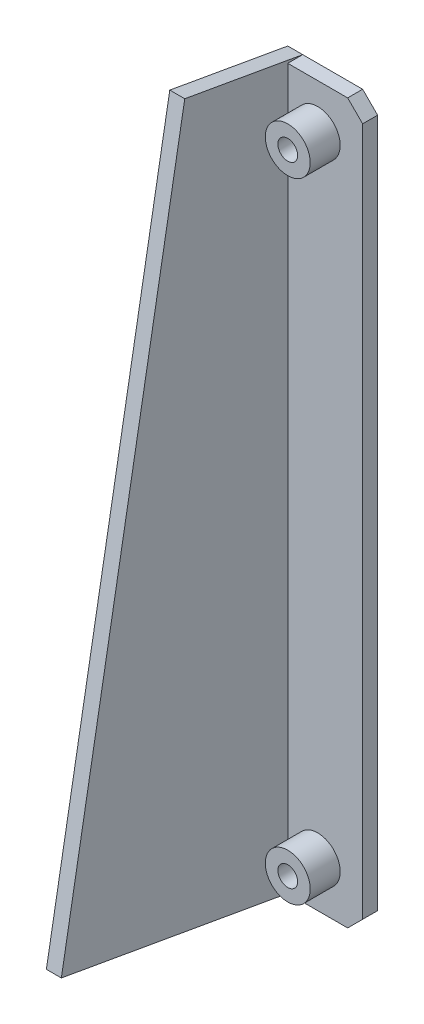
ISO-10303-21;
HEADER;
FILE_DESCRIPTION(('STEP AP214'),'2;1');
FILE_NAME('part.step','',(''),(''),'','','');
FILE_SCHEMA(('AUTOMOTIVE_DESIGN { 1 0 10303 214 1 1 1 1 }'));
ENDSEC;
DATA;
#1=APPLICATION_CONTEXT('core data for automotive mechanical design processes');
#2=APPLICATION_PROTOCOL_DEFINITION('international standard','automotive_design',2000,#1);
#3=PRODUCT_CONTEXT('',#1,'mechanical');
#4=PRODUCT('Part','Part','',(#3));
#5=PRODUCT_RELATED_PRODUCT_CATEGORY('part','',(#4));
#6=PRODUCT_DEFINITION_FORMATION('','',#4);
#7=PRODUCT_DEFINITION_CONTEXT('part definition',#1,'design');
#8=PRODUCT_DEFINITION('design','',#6,#7);
#9=PRODUCT_DEFINITION_SHAPE('','',#8);
#10=(LENGTH_UNIT() NAMED_UNIT(*) SI_UNIT(.MILLI.,.METRE.));
#11=(NAMED_UNIT(*) PLANE_ANGLE_UNIT() SI_UNIT($,.RADIAN.));
#12=(NAMED_UNIT(*) SI_UNIT($,.STERADIAN.) SOLID_ANGLE_UNIT());
#13=UNCERTAINTY_MEASURE_WITH_UNIT(LENGTH_MEASURE(1.E-05),#10,'distance_accuracy_value','');
#14=(GEOMETRIC_REPRESENTATION_CONTEXT(3) GLOBAL_UNCERTAINTY_ASSIGNED_CONTEXT((#13)) GLOBAL_UNIT_ASSIGNED_CONTEXT((#10,
#11,#12)) REPRESENTATION_CONTEXT('',''));
#15=CARTESIAN_POINT('',(0.,0.,0.));
#16=DIRECTION('',(0.,0.,1.));
#17=DIRECTION('',(1.,0.,0.));
#18=AXIS2_PLACEMENT_3D('',#15,#16,#17);
#19=CARTESIAN_POINT('',(0.,2.2977111480569,13.030967460708));
#20=DIRECTION('',(0.,0.173648177666931,0.984807753012208));
#21=DIRECTION('',(0.,-0.984807753012208,0.173648177666931));
#22=AXIS2_PLACEMENT_3D('',#19,#20,#21);
#23=PLANE('',#22);
#24=DIRECTION('',(-0.9995315720834,-0.030139564777048,0.00531441845700435));
#25=VECTOR('',#24,1.);
#26=CARTESIAN_POINT('',(-7.93749999999999,76.2,0.));
#27=LINE('',#26,#25);
#28=CARTESIAN_POINT('',(-7.93749999999999,76.2,0.));
#29=VERTEX_POINT('',#28);
#30=CARTESIAN_POINT('',(-9.525,76.1521310177488,0.00844059310994169));
#31=VERTEX_POINT('',#30);
#32=EDGE_CURVE('E145',#29,#31,#27,.T.);
#33=ORIENTED_EDGE('',*,*,#32,.F.);
#34=DIRECTION('',(-0.701673843159863,-0.701673843159863,0.123724030206484));
#35=VECTOR('',#34,1.);
#36=CARTESIAN_POINT('',(-9.63851621968364,74.4989837803164,0.299935054152948));
#37=LINE('',#36,#35);
#38=CARTESIAN_POINT('',(-9.525,74.6125,0.279919081874694));
#39=VERTEX_POINT('',#38);
#40=EDGE_CURVE('E11',#39,#29,#37,.F.);
#41=ORIENTED_EDGE('',*,*,#40,.F.);
#42=DIRECTION('',(0.,0.984807753012208,-0.173648177666931));
#43=VECTOR('',#42,1.);
#44=CARTESIAN_POINT('',(-9.525,76.2,0.));
#45=LINE('',#44,#43);
#46=EDGE_CURVE('E51',#39,#31,#45,.T.);
#47=ORIENTED_EDGE('',*,*,#46,.T.);
#48=EDGE_LOOP('',(#33,#41,#47));
#49=FACE_BOUND('',#48,.T.);
#50=ADVANCED_FACE('F35',(#49),#23,.F.);
#51=CARTESIAN_POINT('',(-9.525,74.6125,1.5875));
#52=DIRECTION('',(0.707106781186548,-0.707106781186548,0.));
#53=DIRECTION('',(0.,0.,-1.));
#54=AXIS2_PLACEMENT_3D('',#51,#52,#53);
#55=PLANE('',#54);
#56=DIRECTION('',(0.,0.,-1.));
#57=VECTOR('',#56,1.);
#58=CARTESIAN_POINT('',(-9.525,74.6125,1.5875));
#59=LINE('',#58,#57);
#60=CARTESIAN_POINT('',(-9.525,74.6125,0.));
#61=VERTEX_POINT('',#60);
#62=EDGE_CURVE('E58',#39,#61,#59,.T.);
#63=ORIENTED_EDGE('',*,*,#62,.F.);
#64=ORIENTED_EDGE('',*,*,#40,.T.);
#65=DIRECTION('',(-0.707106781186548,-0.707106781186548,0.));
#66=VECTOR('',#65,1.);
#67=CARTESIAN_POINT('',(-9.525,74.6125,0.));
#68=LINE('',#67,#66);
#69=EDGE_CURVE('E232',#61,#29,#68,.F.);
#70=ORIENTED_EDGE('',*,*,#69,.F.);
#71=EDGE_LOOP('',(#63,#64,#70));
#72=FACE_BOUND('',#71,.T.);
#73=ADVANCED_FACE('F297',(#72),#55,.F.);
#74=CARTESIAN_POINT('',(0.,0.,1.5875));
#75=DIRECTION('',(0.,0.,1.));
#76=DIRECTION('',(1.,0.,0.));
#77=AXIS2_PLACEMENT_3D('',#74,#75,#76);
#78=PLANE('',#77);
#79=DIRECTION('',(0.,1.,0.));
#80=VECTOR('',#79,1.);
#81=CARTESIAN_POINT('',(-7.93749999999996,62.1441984664619,1.58750000000001));
#82=LINE('',#81,#80);
#83=CARTESIAN_POINT('',(-7.93749999999984,0.,1.58750000000001));
#84=VERTEX_POINT('',#83);
#85=CARTESIAN_POINT('',(-7.93749999999999,76.2,1.5875));
#86=VERTEX_POINT('',#85);
#87=EDGE_CURVE('E149',#84,#86,#82,.T.);
#88=ORIENTED_EDGE('',*,*,#87,.F.);
#89=DIRECTION('',(1.,0.,0.));
#90=VECTOR('',#89,1.);
#91=CARTESIAN_POINT('',(0.,0.,1.5875));
#92=LINE('',#91,#90);
#93=CARTESIAN_POINT('',(-1.58750000000001,0.,1.5875));
#94=VERTEX_POINT('',#93);
#95=EDGE_CURVE('E209',#84,#94,#92,.T.);
#96=ORIENTED_EDGE('',*,*,#95,.T.);
#97=DIRECTION('',(-0.707106781186551,-0.707106781186544,0.));
#98=VECTOR('',#97,1.);
#99=CARTESIAN_POINT('',(-0.793749999999999,0.793750000000006,1.5875));
#100=LINE('',#99,#98);
#101=CARTESIAN_POINT('',(0.,1.5875,1.5875));
#102=VERTEX_POINT('',#101);
#103=EDGE_CURVE('E245',#94,#102,#100,.F.);
#104=ORIENTED_EDGE('',*,*,#103,.T.);
#105=DIRECTION('',(0.,1.,0.));
#106=VECTOR('',#105,1.);
#107=CARTESIAN_POINT('',(0.,0.,1.5875));
#108=LINE('',#107,#106);
#109=CARTESIAN_POINT('',(0.,74.6125,1.5875));
#110=VERTEX_POINT('',#109);
#111=EDGE_CURVE('E202',#102,#110,#108,.T.);
#112=ORIENTED_EDGE('',*,*,#111,.T.);
#113=DIRECTION('',(0.707106781186548,-0.707106781186548,0.));
#114=VECTOR('',#113,1.);
#115=CARTESIAN_POINT('',(37.30625,37.30625,1.5875));
#116=LINE('',#115,#114);
#117=CARTESIAN_POINT('',(-1.5875,76.2,1.5875));
#118=VERTEX_POINT('',#117);
#119=EDGE_CURVE('E247',#110,#118,#116,.F.);
#120=ORIENTED_EDGE('',*,*,#119,.T.);
#121=DIRECTION('',(-1.,0.,0.));
#122=VECTOR('',#121,1.);
#123=CARTESIAN_POINT('',(0.,76.2,1.5875));
#124=LINE('',#123,#122);
#125=EDGE_CURVE('E205',#118,#86,#124,.T.);
#126=ORIENTED_EDGE('',*,*,#125,.T.);
#127=EDGE_LOOP('',(#88,#96,#104,#112,#120,#126));
#128=FACE_BOUND('',#127,.T.);
#129=CARTESIAN_POINT('',(-4.7625,4.7625,1.5875));
#130=DIRECTION('',(0.,0.,1.));
#131=DIRECTION('',(1.,0.,0.));
#132=AXIS2_PLACEMENT_3D('',#129,#130,#131);
#133=CIRCLE('',#132,2.38125);
#134=CARTESIAN_POINT('',(-2.38125,4.7625,1.5875));
#135=VERTEX_POINT('',#134);
#136=EDGE_CURVE('E189',#135,#135,#133,.T.);
#137=ORIENTED_EDGE('',*,*,#136,.F.);
#138=EDGE_LOOP('',(#137));
#139=FACE_BOUND('',#138,.T.);
#140=CARTESIAN_POINT('',(-4.7625,71.4375,1.5875));
#141=DIRECTION('',(0.,0.,1.));
#142=DIRECTION('',(-1.,0.,0.));
#143=AXIS2_PLACEMENT_3D('',#140,#141,#142);
#144=CIRCLE('',#143,2.38125);
#145=CARTESIAN_POINT('',(-7.14375,71.4375,1.5875));
#146=VERTEX_POINT('',#145);
#147=EDGE_CURVE('E180',#146,#146,#144,.T.);
#148=ORIENTED_EDGE('',*,*,#147,.F.);
#149=EDGE_LOOP('',(#148));
#150=FACE_BOUND('',#149,.T.);
#151=ADVANCED_FACE('F263',(#128,#139,#150),#78,.T.);
#152=CARTESIAN_POINT('',(0.,0.,1.5875));
#153=DIRECTION('',(-1.,0.,0.));
#154=DIRECTION('',(0.,0.,1.));
#155=AXIS2_PLACEMENT_3D('',#152,#153,#154);
#156=PLANE('',#155);
#157=DIRECTION('',(0.,1.,0.));
#158=VECTOR('',#157,1.);
#159=CARTESIAN_POINT('',(0.,0.,0.));
#160=LINE('',#159,#158);
#161=CARTESIAN_POINT('',(0.,1.5875,0.));
#162=VERTEX_POINT('',#161);
#163=CARTESIAN_POINT('',(0.,74.6125,0.));
#164=VERTEX_POINT('',#163);
#165=EDGE_CURVE('E201',#162,#164,#160,.T.);
#166=ORIENTED_EDGE('',*,*,#165,.T.);
#167=DIRECTION('',(0.,0.,1.));
#168=VECTOR('',#167,1.);
#169=CARTESIAN_POINT('',(0.,74.6125,1.5875));
#170=LINE('',#169,#168);
#171=EDGE_CURVE('E240',#164,#110,#170,.T.);
#172=ORIENTED_EDGE('',*,*,#171,.T.);
#173=ORIENTED_EDGE('',*,*,#111,.F.);
#174=DIRECTION('',(0.,0.,-1.));
#175=VECTOR('',#174,1.);
#176=CARTESIAN_POINT('',(0.,1.5875,1.5875));
#177=LINE('',#176,#175);
#178=EDGE_CURVE('E237',#102,#162,#177,.T.);
#179=ORIENTED_EDGE('',*,*,#178,.T.);
#180=EDGE_LOOP('',(#166,#172,#173,#179));
#181=FACE_BOUND('',#180,.T.);
#182=ADVANCED_FACE('F270',(#181),#156,.F.);
#183=CARTESIAN_POINT('',(0.,76.2,1.5875));
#184=DIRECTION('',(0.,-1.,0.));
#185=DIRECTION('',(1.,0.,0.));
#186=AXIS2_PLACEMENT_3D('',#183,#184,#185);
#187=PLANE('',#186);
#188=ORIENTED_EDGE('',*,*,#125,.F.);
#189=DIRECTION('',(0.,0.,-1.));
#190=VECTOR('',#189,1.);
#191=CARTESIAN_POINT('',(-1.5875,76.2,1.5875));
#192=LINE('',#191,#190);
#193=CARTESIAN_POINT('',(-1.5875,76.2,0.));
#194=VERTEX_POINT('',#193);
#195=EDGE_CURVE('E225',#118,#194,#192,.T.);
#196=ORIENTED_EDGE('',*,*,#195,.T.);
#197=DIRECTION('',(-1.,0.,0.));
#198=VECTOR('',#197,1.);
#199=CARTESIAN_POINT('',(0.,76.2,0.));
#200=LINE('',#199,#198);
#201=EDGE_CURVE('E215',#194,#29,#200,.T.);
#202=ORIENTED_EDGE('',*,*,#201,.T.);
#203=DIRECTION('',(0.,0.,1.));
#204=VECTOR('',#203,1.);
#205=CARTESIAN_POINT('',(-7.93749999999999,76.2,1.5875));
#206=LINE('',#205,#204);
#207=EDGE_CURVE('E212',#29,#86,#206,.T.);
#208=ORIENTED_EDGE('',*,*,#207,.T.);
#209=EDGE_LOOP('',(#188,#196,#202,#208));
#210=FACE_BOUND('',#209,.T.);
#211=ADVANCED_FACE('F281',(#210),#187,.F.);
#212=CARTESIAN_POINT('',(-9.52500000000001,0.,1.5875));
#213=DIRECTION('',(1.,0.,0.));
#214=DIRECTION('',(0.,1.,0.));
#215=AXIS2_PLACEMENT_3D('',#212,#213,#214);
#216=PLANE('',#215);
#217=ORIENTED_EDGE('',*,*,#46,.F.);
#218=ORIENTED_EDGE('',*,*,#62,.T.);
#219=DIRECTION('',(0.,-1.,0.));
#220=VECTOR('',#219,1.);
#221=CARTESIAN_POINT('',(-9.52500000000001,0.,0.));
#222=LINE('',#221,#220);
#223=CARTESIAN_POINT('',(-9.52500000000001,1.58749999999999,0.));
#224=VERTEX_POINT('',#223);
#225=EDGE_CURVE('E218',#61,#224,#222,.T.);
#226=ORIENTED_EDGE('',*,*,#225,.T.);
#227=DIRECTION('',(0.,0.,1.));
#228=VECTOR('',#227,1.);
#229=CARTESIAN_POINT('',(-9.52500000000001,1.58749999999999,1.5875));
#230=LINE('',#229,#228);
#231=CARTESIAN_POINT('',(-9.52500000000001,1.58749999999999,1.5875));
#232=VERTEX_POINT('',#231);
#233=EDGE_CURVE('E249',#224,#232,#230,.T.);
#234=ORIENTED_EDGE('',*,*,#233,.T.);
#235=DIRECTION('',(0.,-1.,0.));
#236=VECTOR('',#235,1.);
#237=CARTESIAN_POINT('',(-9.52499999999997,62.1441984664619,1.58750000000001));
#238=LINE('',#237,#236);
#239=CARTESIAN_POINT('',(-9.52499999999984,0.,1.58750000000001));
#240=VERTEX_POINT('',#239);
#241=EDGE_CURVE('E151',#232,#240,#238,.T.);
#242=ORIENTED_EDGE('',*,*,#241,.T.);
#243=DIRECTION('',(0.,-0.173648177666931,-0.984807753012208));
#244=VECTOR('',#243,1.);
#245=CARTESIAN_POINT('',(-9.52499999999985,4.23156451566216,25.5858949062142));
#246=LINE('',#245,#244);
#247=CARTESIAN_POINT('',(-9.52499999999985,4.23156451566216,25.5858949062142));
#248=VERTEX_POINT('',#247);
#249=EDGE_CURVE('E168',#248,#240,#246,.T.);
#250=ORIENTED_EDGE('',*,*,#249,.F.);
#251=DIRECTION('',(0.,0.984807753012208,-0.173648177666931));
#252=VECTOR('',#251,1.);
#253=CARTESIAN_POINT('',(-9.52500000000001,78.40533185637,12.507058463255));
#254=LINE('',#253,#252);
#255=CARTESIAN_POINT('',(-9.52500000000001,78.40533185637,12.507058463255));
#256=VERTEX_POINT('',#255);
#257=EDGE_CURVE('E155',#248,#256,#254,.T.);
#258=ORIENTED_EDGE('',*,*,#257,.T.);
#259=DIRECTION('',(0.,-0.173648177666931,-0.984807753012208));
#260=VECTOR('',#259,1.);
#261=CARTESIAN_POINT('',(-9.52500000000001,78.40533185637,12.507058463255));
#262=LINE('',#261,#260);
#263=CARTESIAN_POINT('',(-9.525,76.2,0.));
#264=VERTEX_POINT('',#263);
#265=EDGE_CURVE('E142',#256,#264,#262,.T.);
#266=ORIENTED_EDGE('',*,*,#265,.T.);
#267=DIRECTION('',(0.,-1.,0.));
#268=VECTOR('',#267,1.);
#269=CARTESIAN_POINT('',(-9.525,75.8734638967618,0.));
#270=LINE('',#269,#268);
#271=CARTESIAN_POINT('',(-9.525,76.1506427134504,0.));
#272=VERTEX_POINT('',#271);
#273=EDGE_CURVE('E130',#264,#272,#270,.T.);
#274=ORIENTED_EDGE('',*,*,#273,.T.);
#275=DIRECTION('',(0.,0.173648177666931,0.984807753012208));
#276=VECTOR('',#275,1.);
#277=CARTESIAN_POINT('',(-9.525,75.8734638967618,-1.57195918386868));
#278=LINE('',#277,#276);
#279=EDGE_CURVE('E140',#272,#31,#278,.T.);
#280=ORIENTED_EDGE('',*,*,#279,.T.);
#281=EDGE_LOOP('',(#217,#218,#226,#234,#242,#250,#258,#266,#274,#280));
#282=FACE_BOUND('',#281,.T.);
#283=ADVANCED_FACE('F139',(#282),#216,.F.);
#284=CARTESIAN_POINT('',(0.,0.,1.5875));
#285=DIRECTION('',(0.,1.,0.));
#286=DIRECTION('',(-1.,0.,0.));
#287=AXIS2_PLACEMENT_3D('',#284,#285,#286);
#288=PLANE('',#287);
#289=DIRECTION('',(1.,0.,0.));
#290=VECTOR('',#289,1.);
#291=CARTESIAN_POINT('',(0.,0.,0.));
#292=LINE('',#291,#290);
#293=CARTESIAN_POINT('',(-7.93750000000003,0.,0.));
#294=VERTEX_POINT('',#293);
#295=CARTESIAN_POINT('',(-1.58750000000001,0.,0.));
#296=VERTEX_POINT('',#295);
#297=EDGE_CURVE('E206',#294,#296,#292,.T.);
#298=ORIENTED_EDGE('',*,*,#297,.T.);
#299=DIRECTION('',(0.,0.,1.));
#300=VECTOR('',#299,1.);
#301=CARTESIAN_POINT('',(-1.58750000000001,0.,1.5875));
#302=LINE('',#301,#300);
#303=EDGE_CURVE('E44',#296,#94,#302,.T.);
#304=ORIENTED_EDGE('',*,*,#303,.T.);
#305=ORIENTED_EDGE('',*,*,#95,.F.);
#306=DIRECTION('',(0.,0.,-1.));
#307=VECTOR('',#306,1.);
#308=CARTESIAN_POINT('',(-7.93750000000003,0.,1.5875));
#309=LINE('',#308,#307);
#310=EDGE_CURVE('E252',#84,#294,#309,.T.);
#311=ORIENTED_EDGE('',*,*,#310,.T.);
#312=EDGE_LOOP('',(#298,#304,#305,#311));
#313=FACE_BOUND('',#312,.T.);
#314=ADVANCED_FACE('F257',(#313),#288,.F.);
#315=CARTESIAN_POINT('',(0.,0.,0.));
#316=DIRECTION('',(0.,0.,1.));
#317=DIRECTION('',(1.,0.,0.));
#318=AXIS2_PLACEMENT_3D('',#315,#316,#317);
#319=PLANE('',#318);
#320=CARTESIAN_POINT('',(-4.7625,4.7625,0.));
#321=DIRECTION('',(0.,0.,1.));
#322=DIRECTION('',(1.,0.,0.));
#323=AXIS2_PLACEMENT_3D('',#320,#321,#322);
#324=CIRCLE('',#323,1.04775);
#325=CARTESIAN_POINT('',(-3.71475,4.7625,0.));
#326=VERTEX_POINT('',#325);
#327=EDGE_CURVE('E193',#326,#326,#324,.T.);
#328=ORIENTED_EDGE('',*,*,#327,.T.);
#329=EDGE_LOOP('',(#328));
#330=FACE_BOUND('',#329,.T.);
#331=CARTESIAN_POINT('',(-4.7625,71.4375,0.));
#332=DIRECTION('',(0.,0.,1.));
#333=DIRECTION('',(1.,0.,0.));
#334=AXIS2_PLACEMENT_3D('',#331,#332,#333);
#335=CIRCLE('',#334,1.04775);
#336=CARTESIAN_POINT('',(-3.71475,71.4375,0.));
#337=VERTEX_POINT('',#336);
#338=EDGE_CURVE('E198',#337,#337,#335,.T.);
#339=ORIENTED_EDGE('',*,*,#338,.T.);
#340=EDGE_LOOP('',(#339));
#341=FACE_BOUND('',#340,.T.);
#342=ORIENTED_EDGE('',*,*,#201,.F.);
#343=DIRECTION('',(-0.707106781186548,0.707106781186548,0.));
#344=VECTOR('',#343,1.);
#345=CARTESIAN_POINT('',(-1.58750000000001,76.2,0.));
#346=LINE('',#345,#344);
#347=EDGE_CURVE('E235',#194,#164,#346,.F.);
#348=ORIENTED_EDGE('',*,*,#347,.T.);
#349=ORIENTED_EDGE('',*,*,#165,.F.);
#350=DIRECTION('',(0.707106781186551,0.707106781186544,0.));
#351=VECTOR('',#350,1.);
#352=CARTESIAN_POINT('',(0.,1.5875,0.));
#353=LINE('',#352,#351);
#354=EDGE_CURVE('E230',#162,#296,#353,.F.);
#355=ORIENTED_EDGE('',*,*,#354,.T.);
#356=ORIENTED_EDGE('',*,*,#297,.F.);
#357=DIRECTION('',(0.707106781186544,-0.707106781186551,0.));
#358=VECTOR('',#357,1.);
#359=CARTESIAN_POINT('',(-7.93750000000003,0.,0.));
#360=LINE('',#359,#358);
#361=EDGE_CURVE('E228',#294,#224,#360,.F.);
#362=ORIENTED_EDGE('',*,*,#361,.T.);
#363=ORIENTED_EDGE('',*,*,#225,.F.);
#364=ORIENTED_EDGE('',*,*,#69,.T.);
#365=EDGE_LOOP('',(#342,#348,#349,#355,#356,#362,#363,#364));
#366=FACE_BOUND('',#365,.T.);
#367=ADVANCED_FACE('F274',(#330,#341,#366),#319,.F.);
#368=CARTESIAN_POINT('',(-1.58750000000001,76.2,1.5875));
#369=DIRECTION('',(-0.707106781186548,-0.707106781186548,0.));
#370=DIRECTION('',(0.,0.,-1.));
#371=AXIS2_PLACEMENT_3D('',#368,#369,#370);
#372=PLANE('',#371);
#373=ORIENTED_EDGE('',*,*,#119,.F.);
#374=ORIENTED_EDGE('',*,*,#171,.F.);
#375=ORIENTED_EDGE('',*,*,#347,.F.);
#376=ORIENTED_EDGE('',*,*,#195,.F.);
#377=EDGE_LOOP('',(#373,#374,#375,#376));
#378=FACE_BOUND('',#377,.T.);
#379=ADVANCED_FACE('F278',(#378),#372,.F.);
#380=CARTESIAN_POINT('',(0.,1.5875,1.5875));
#381=DIRECTION('',(-0.707106781186544,0.707106781186551,0.));
#382=DIRECTION('',(0.,0.,-1.));
#383=AXIS2_PLACEMENT_3D('',#380,#381,#382);
#384=PLANE('',#383);
#385=ORIENTED_EDGE('',*,*,#103,.F.);
#386=ORIENTED_EDGE('',*,*,#303,.F.);
#387=ORIENTED_EDGE('',*,*,#354,.F.);
#388=ORIENTED_EDGE('',*,*,#178,.F.);
#389=EDGE_LOOP('',(#385,#386,#387,#388));
#390=FACE_BOUND('',#389,.T.);
#391=ADVANCED_FACE('F267',(#390),#384,.F.);
#392=CARTESIAN_POINT('',(-7.93750000000003,0.,1.5875));
#393=DIRECTION('',(0.707106781186551,0.707106781186544,0.));
#394=DIRECTION('',(0.,0.,-1.));
#395=AXIS2_PLACEMENT_3D('',#392,#393,#394);
#396=PLANE('',#395);
#397=DIRECTION('',(-0.707106781186544,0.707106781186551,0.));
#398=VECTOR('',#397,1.);
#399=CARTESIAN_POINT('',(-3.96875000000005,-3.96875000000002,1.5875));
#400=LINE('',#399,#398);
#401=EDGE_CURVE('E242',#232,#84,#400,.F.);
#402=ORIENTED_EDGE('',*,*,#401,.F.);
#403=ORIENTED_EDGE('',*,*,#233,.F.);
#404=ORIENTED_EDGE('',*,*,#361,.F.);
#405=ORIENTED_EDGE('',*,*,#310,.F.);
#406=EDGE_LOOP('',(#402,#403,#404,#405));
#407=FACE_BOUND('',#406,.T.);
#408=ADVANCED_FACE('F38',(#407),#396,.F.);
#409=CARTESIAN_POINT('',(-4.7625,71.4375,1.5875));
#410=DIRECTION('',(0.,0.,1.));
#411=DIRECTION('',(1.,0.,0.));
#412=AXIS2_PLACEMENT_3D('',#409,#410,#411);
#413=CYLINDRICAL_SURFACE('',#412,1.04775);
#414=ORIENTED_EDGE('',*,*,#338,.F.);
#415=EDGE_LOOP('',(#414));
#416=FACE_BOUND('',#415,.T.);
#417=CARTESIAN_POINT('',(-4.7625,71.4375,4.7625));
#418=DIRECTION('',(0.,0.,1.));
#419=DIRECTION('',(-1.,0.,0.));
#420=AXIS2_PLACEMENT_3D('',#417,#418,#419);
#421=CIRCLE('',#420,1.04775);
#422=CARTESIAN_POINT('',(-5.81025,71.4375,4.7625));
#423=VERTEX_POINT('',#422);
#424=EDGE_CURVE('E171',#423,#423,#421,.T.);
#425=ORIENTED_EDGE('',*,*,#424,.T.);
#426=EDGE_LOOP('',(#425));
#427=FACE_BOUND('',#426,.T.);
#428=ADVANCED_FACE('F335',(#416,#427),#413,.F.);
#429=CARTESIAN_POINT('',(-4.7625,4.7625,1.5875));
#430=DIRECTION('',(0.,0.,1.));
#431=DIRECTION('',(1.,0.,0.));
#432=AXIS2_PLACEMENT_3D('',#429,#430,#431);
#433=CYLINDRICAL_SURFACE('',#432,1.04775);
#434=ORIENTED_EDGE('',*,*,#327,.F.);
#435=EDGE_LOOP('',(#434));
#436=FACE_BOUND('',#435,.T.);
#437=CARTESIAN_POINT('',(-4.7625,4.7625,4.7625));
#438=DIRECTION('',(0.,0.,1.));
#439=DIRECTION('',(1.,0.,0.));
#440=AXIS2_PLACEMENT_3D('',#437,#438,#439);
#441=CIRCLE('',#440,1.04775);
#442=CARTESIAN_POINT('',(-3.71475,4.7625,4.7625));
#443=VERTEX_POINT('',#442);
#444=EDGE_CURVE('E184',#443,#443,#441,.T.);
#445=ORIENTED_EDGE('',*,*,#444,.T.);
#446=EDGE_LOOP('',(#445));
#447=FACE_BOUND('',#446,.T.);
#448=ADVANCED_FACE('F328',(#436,#447),#433,.F.);
#449=CARTESIAN_POINT('',(-4.7625,4.7625,4.7625));
#450=DIRECTION('',(0.,0.,1.));
#451=DIRECTION('',(1.,0.,0.));
#452=AXIS2_PLACEMENT_3D('',#449,#450,#451);
#453=PLANE('',#452);
#454=CARTESIAN_POINT('',(-4.7625,4.7625,4.7625));
#455=DIRECTION('',(0.,0.,1.));
#456=DIRECTION('',(1.,0.,0.));
#457=AXIS2_PLACEMENT_3D('',#454,#455,#456);
#458=CIRCLE('',#457,2.38125);
#459=CARTESIAN_POINT('',(-2.38125,4.7625,4.7625));
#460=VERTEX_POINT('',#459);
#461=EDGE_CURVE('E190',#460,#460,#458,.T.);
#462=ORIENTED_EDGE('',*,*,#461,.T.);
#463=EDGE_LOOP('',(#462));
#464=FACE_BOUND('',#463,.T.);
#465=ORIENTED_EDGE('',*,*,#444,.F.);
#466=EDGE_LOOP('',(#465));
#467=FACE_BOUND('',#466,.T.);
#468=ADVANCED_FACE('F325',(#464,#467),#453,.T.);
#469=CARTESIAN_POINT('',(-4.7625,4.7625,4.7625));
#470=DIRECTION('',(0.,0.,-1.));
#471=DIRECTION('',(-1.,0.,0.));
#472=AXIS2_PLACEMENT_3D('',#469,#470,#471);
#473=CYLINDRICAL_SURFACE('',#472,2.38125);
#474=ORIENTED_EDGE('',*,*,#461,.F.);
#475=EDGE_LOOP('',(#474));
#476=FACE_BOUND('',#475,.T.);
#477=ORIENTED_EDGE('',*,*,#136,.T.);
#478=EDGE_LOOP('',(#477));
#479=FACE_BOUND('',#478,.T.);
#480=ADVANCED_FACE('F320',(#476,#479),#473,.T.);
#481=CARTESIAN_POINT('',(-4.7625,71.4375,4.7625));
#482=DIRECTION('',(0.,0.,-1.));
#483=DIRECTION('',(-1.,0.,0.));
#484=AXIS2_PLACEMENT_3D('',#481,#482,#483);
#485=PLANE('',#484);
#486=CARTESIAN_POINT('',(-4.7625,71.4375,4.7625));
#487=DIRECTION('',(0.,0.,1.));
#488=DIRECTION('',(-1.,0.,0.));
#489=AXIS2_PLACEMENT_3D('',#486,#487,#488);
#490=CIRCLE('',#489,2.38125);
#491=CARTESIAN_POINT('',(-7.14375,71.4375,4.7625));
#492=VERTEX_POINT('',#491);
#493=EDGE_CURVE('E181',#492,#492,#490,.T.);
#494=ORIENTED_EDGE('',*,*,#493,.T.);
#495=EDGE_LOOP('',(#494));
#496=FACE_BOUND('',#495,.T.);
#497=ORIENTED_EDGE('',*,*,#424,.F.);
#498=EDGE_LOOP('',(#497));
#499=FACE_BOUND('',#498,.T.);
#500=ADVANCED_FACE('F317',(#496,#499),#485,.F.);
#501=CARTESIAN_POINT('',(-4.7625,71.4375,4.7625));
#502=DIRECTION('',(0.,0.,-1.));
#503=DIRECTION('',(-1.,0.,0.));
#504=AXIS2_PLACEMENT_3D('',#501,#502,#503);
#505=CYLINDRICAL_SURFACE('',#504,2.38125);
#506=ORIENTED_EDGE('',*,*,#493,.F.);
#507=EDGE_LOOP('',(#506));
#508=FACE_BOUND('',#507,.T.);
#509=ORIENTED_EDGE('',*,*,#147,.T.);
#510=EDGE_LOOP('',(#509));
#511=FACE_BOUND('',#510,.T.);
#512=ADVANCED_FACE('F310',(#508,#511),#505,.T.);
#513=CARTESIAN_POINT('',(-9.52499999999985,4.23156451566216,25.5858949062142));
#514=DIRECTION('',(0.,-0.984807753012208,0.173648177666931));
#515=DIRECTION('',(0.,-0.173648177666931,-0.984807753012208));
#516=AXIS2_PLACEMENT_3D('',#513,#514,#515);
#517=PLANE('',#516);
#518=ORIENTED_EDGE('',*,*,#249,.T.);
#519=DIRECTION('',(1.,0.,0.));
#520=VECTOR('',#519,1.);
#521=CARTESIAN_POINT('',(-9.52499999999984,0.,1.58750000000001));
#522=LINE('',#521,#520);
#523=EDGE_CURVE('E136',#240,#84,#522,.T.);
#524=ORIENTED_EDGE('',*,*,#523,.T.);
#525=DIRECTION('',(0.,-0.173648177666931,-0.984807753012208));
#526=VECTOR('',#525,1.);
#527=CARTESIAN_POINT('',(-7.93749999999985,4.23156451566217,25.5858949062142));
#528=LINE('',#527,#526);
#529=CARTESIAN_POINT('',(-7.93749999999985,4.23156451566217,25.5858949062142));
#530=VERTEX_POINT('',#529);
#531=EDGE_CURVE('E172',#530,#84,#528,.T.);
#532=ORIENTED_EDGE('',*,*,#531,.F.);
#533=DIRECTION('',(-1.,0.,0.));
#534=VECTOR('',#533,1.);
#535=CARTESIAN_POINT('',(-9.52499999999985,4.23156451566216,25.5858949062142));
#536=LINE('',#535,#534);
#537=EDGE_CURVE('E163',#530,#248,#536,.T.);
#538=ORIENTED_EDGE('',*,*,#537,.T.);
#539=EDGE_LOOP('',(#518,#524,#532,#538));
#540=FACE_BOUND('',#539,.T.);
#541=ADVANCED_FACE('F289',(#540),#517,.T.);
#542=CARTESIAN_POINT('',(-7.93749999999999,78.40533185637,12.507058463255));
#543=DIRECTION('',(1.,0.,0.));
#544=DIRECTION('',(0.,1.,0.));
#545=AXIS2_PLACEMENT_3D('',#542,#543,#544);
#546=PLANE('',#545);
#547=ORIENTED_EDGE('',*,*,#87,.T.);
#548=ORIENTED_EDGE('',*,*,#207,.F.);
#549=DIRECTION('',(0.,-0.173648177666931,-0.984807753012208));
#550=VECTOR('',#549,1.);
#551=CARTESIAN_POINT('',(-7.93749999999999,78.40533185637,12.507058463255));
#552=LINE('',#551,#550);
#553=CARTESIAN_POINT('',(-7.93749999999999,78.40533185637,12.507058463255));
#554=VERTEX_POINT('',#553);
#555=EDGE_CURVE('E175',#554,#29,#552,.T.);
#556=ORIENTED_EDGE('',*,*,#555,.F.);
#557=DIRECTION('',(0.,-0.984807753012208,0.173648177666931));
#558=VECTOR('',#557,1.);
#559=CARTESIAN_POINT('',(-7.93749999999999,78.40533185637,12.507058463255));
#560=LINE('',#559,#558);
#561=EDGE_CURVE('E160',#554,#530,#560,.T.);
#562=ORIENTED_EDGE('',*,*,#561,.T.);
#563=ORIENTED_EDGE('',*,*,#531,.T.);
#564=EDGE_LOOP('',(#547,#548,#556,#562,#563));
#565=FACE_BOUND('',#564,.T.);
#566=ADVANCED_FACE('F284',(#565),#546,.T.);
#567=CARTESIAN_POINT('',(-9.52500000000001,78.40533185637,12.507058463255));
#568=DIRECTION('',(0.,0.984807753012208,-0.173648177666931));
#569=DIRECTION('',(0.,0.173648177666931,0.984807753012208));
#570=AXIS2_PLACEMENT_3D('',#567,#568,#569);
#571=PLANE('',#570);
#572=DIRECTION('',(1.,0.,0.));
#573=VECTOR('',#572,1.);
#574=CARTESIAN_POINT('',(-9.525,76.2,0.));
#575=LINE('',#574,#573);
#576=EDGE_CURVE('E132',#264,#29,#575,.T.);
#577=ORIENTED_EDGE('',*,*,#576,.F.);
#578=ORIENTED_EDGE('',*,*,#265,.F.);
#579=DIRECTION('',(1.,0.,0.));
#580=VECTOR('',#579,1.);
#581=CARTESIAN_POINT('',(-9.52500000000001,78.40533185637,12.507058463255));
#582=LINE('',#581,#580);
#583=EDGE_CURVE('E157',#256,#554,#582,.T.);
#584=ORIENTED_EDGE('',*,*,#583,.T.);
#585=ORIENTED_EDGE('',*,*,#555,.T.);
#586=EDGE_LOOP('',(#577,#578,#584,#585));
#587=FACE_BOUND('',#586,.T.);
#588=ADVANCED_FACE('F313',(#587),#571,.T.);
#589=CARTESIAN_POINT('',(0.,4.50304300442692,25.5380259239631));
#590=DIRECTION('',(0.,0.173648177666931,0.984807753012208));
#591=DIRECTION('',(0.,-0.984807753012208,0.173648177666931));
#592=AXIS2_PLACEMENT_3D('',#589,#590,#591);
#593=PLANE('',#592);
#594=ORIENTED_EDGE('',*,*,#257,.F.);
#595=ORIENTED_EDGE('',*,*,#537,.F.);
#596=ORIENTED_EDGE('',*,*,#561,.F.);
#597=ORIENTED_EDGE('',*,*,#583,.F.);
#598=EDGE_LOOP('',(#594,#595,#596,#597));
#599=FACE_BOUND('',#598,.T.);
#600=ADVANCED_FACE('F306',(#599),#593,.T.);
#601=CARTESIAN_POINT('',(0.,0.,1.5875));
#602=DIRECTION('',(0.,0.,1.));
#603=DIRECTION('',(1.,0.,0.));
#604=AXIS2_PLACEMENT_3D('',#601,#602,#603);
#605=PLANE('',#604);
#606=ORIENTED_EDGE('',*,*,#401,.T.);
#607=ORIENTED_EDGE('',*,*,#523,.F.);
#608=ORIENTED_EDGE('',*,*,#241,.F.);
#609=EDGE_LOOP('',(#606,#607,#608));
#610=FACE_BOUND('',#609,.T.);
#611=ADVANCED_FACE('F292',(#610),#605,.F.);
#612=CARTESIAN_POINT('',(-7.93749999999999,75.921332879013,-1.58039977697862));
#613=DIRECTION('',(-0.0306045161452688,0.984346441568213,-0.173566836012845));
#614=DIRECTION('',(0.,0.173648177666931,0.984807753012208));
#615=AXIS2_PLACEMENT_3D('',#612,#613,#614);
#616=PLANE('',#615);
#617=ORIENTED_EDGE('',*,*,#279,.F.);
#618=DIRECTION('',(0.999517018644956,0.0310761876538675,0.));
#619=VECTOR('',#618,1.);
#620=CARTESIAN_POINT('',(-7.94615572916883,76.1997308829576,0.));
#621=LINE('',#620,#619);
#622=EDGE_CURVE('E127',#272,#29,#621,.T.);
#623=ORIENTED_EDGE('',*,*,#622,.T.);
#624=ORIENTED_EDGE('',*,*,#32,.T.);
#625=EDGE_LOOP('',(#617,#623,#624));
#626=FACE_BOUND('',#625,.T.);
#627=ADVANCED_FACE('F144',(#626),#616,.F.);
#628=CARTESIAN_POINT('',(0.,0.,0.));
#629=DIRECTION('',(0.,0.,1.));
#630=DIRECTION('',(1.,0.,0.));
#631=AXIS2_PLACEMENT_3D('',#628,#629,#630);
#632=PLANE('',#631);
#633=ORIENTED_EDGE('',*,*,#273,.F.);
#634=ORIENTED_EDGE('',*,*,#576,.T.);
#635=ORIENTED_EDGE('',*,*,#622,.F.);
#636=EDGE_LOOP('',(#633,#634,#635));
#637=FACE_BOUND('',#636,.T.);
#638=ADVANCED_FACE('F129',(#637),#632,.F.);
#639=CLOSED_SHELL('',(#50,#73,#151,#182,#211,#283,#314,#367,#379,#391,#408,#428,#448,#468,#480,
#500,#512,#541,#566,#588,#600,#611,#627,#638));
#640=MANIFOLD_SOLID_BREP('B2',#639);
#641=ADVANCED_BREP_SHAPE_REPRESENTATION('',(#18,#640),#14);
#642=SHAPE_DEFINITION_REPRESENTATION(#9,#641);
ENDSEC;
END-ISO-10303-21;
